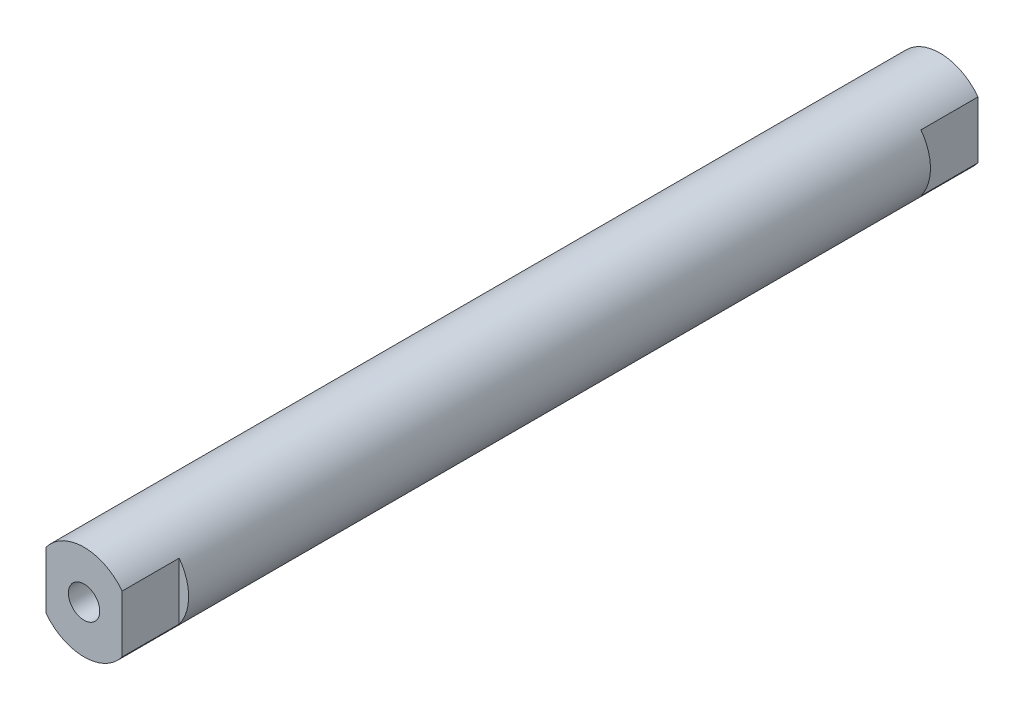
ISO-10303-21;
HEADER;
FILE_DESCRIPTION(('STEP AP214'),'2;1');
FILE_NAME('part.step','',(''),(''),'','','');
FILE_SCHEMA(('AUTOMOTIVE_DESIGN { 1 0 10303 214 1 1 1 1 }'));
ENDSEC;
DATA;
#1=APPLICATION_CONTEXT('core data for automotive mechanical design processes');
#2=APPLICATION_PROTOCOL_DEFINITION('international standard','automotive_design',2000,#1);
#3=PRODUCT_CONTEXT('',#1,'mechanical');
#4=PRODUCT('Part','Part','',(#3));
#5=PRODUCT_RELATED_PRODUCT_CATEGORY('part','',(#4));
#6=PRODUCT_DEFINITION_FORMATION('','',#4);
#7=PRODUCT_DEFINITION_CONTEXT('part definition',#1,'design');
#8=PRODUCT_DEFINITION('design','',#6,#7);
#9=PRODUCT_DEFINITION_SHAPE('','',#8);
#10=(LENGTH_UNIT() NAMED_UNIT(*) SI_UNIT(.MILLI.,.METRE.));
#11=(NAMED_UNIT(*) PLANE_ANGLE_UNIT() SI_UNIT($,.RADIAN.));
#12=(NAMED_UNIT(*) SI_UNIT($,.STERADIAN.) SOLID_ANGLE_UNIT());
#13=UNCERTAINTY_MEASURE_WITH_UNIT(LENGTH_MEASURE(1.E-05),#10,'distance_accuracy_value','');
#14=(GEOMETRIC_REPRESENTATION_CONTEXT(3) GLOBAL_UNCERTAINTY_ASSIGNED_CONTEXT((#13)) GLOBAL_UNIT_ASSIGNED_CONTEXT((#10,
#11,#12)) REPRESENTATION_CONTEXT('',''));
#15=CARTESIAN_POINT('',(0.,0.,0.));
#16=DIRECTION('',(0.,0.,1.));
#17=DIRECTION('',(1.,0.,0.));
#18=AXIS2_PLACEMENT_3D('',#15,#16,#17);
#19=CARTESIAN_POINT('',(0.,0.,45.));
#20=DIRECTION('',(0.,0.,-1.));
#21=DIRECTION('',(-1.,0.,0.));
#22=AXIS2_PLACEMENT_3D('',#19,#20,#21);
#23=CYLINDRICAL_SURFACE('',#22,5.);
#24=CARTESIAN_POINT('',(0.,0.,45.));
#25=DIRECTION('',(0.,0.,1.));
#26=DIRECTION('',(1.,0.,0.));
#27=AXIS2_PLACEMENT_3D('',#24,#25,#26);
#28=CIRCLE('',#27,5.);
#29=CARTESIAN_POINT('',(4.,3.,45.));
#30=VERTEX_POINT('',#29);
#31=CARTESIAN_POINT('',(-4.,3.,45.));
#32=VERTEX_POINT('',#31);
#33=EDGE_CURVE('E44',#30,#32,#28,.T.);
#34=ORIENTED_EDGE('',*,*,#33,.F.);
#35=DIRECTION('',(0.,0.,1.));
#36=VECTOR('',#35,1.);
#37=CARTESIAN_POINT('',(4.,3.,39.));
#38=LINE('',#37,#36);
#39=CARTESIAN_POINT('',(4.,3.,39.));
#40=VERTEX_POINT('',#39);
#41=EDGE_CURVE('E157',#40,#30,#38,.T.);
#42=ORIENTED_EDGE('',*,*,#41,.F.);
#43=CARTESIAN_POINT('',(0.,0.,39.));
#44=DIRECTION('',(0.,0.,1.));
#45=DIRECTION('',(1.,0.,0.));
#46=AXIS2_PLACEMENT_3D('',#43,#44,#45);
#47=CIRCLE('',#46,5.);
#48=CARTESIAN_POINT('',(4.,-3.,39.));
#49=VERTEX_POINT('',#48);
#50=EDGE_CURVE('E152',#49,#40,#47,.T.);
#51=ORIENTED_EDGE('',*,*,#50,.F.);
#52=DIRECTION('',(0.,0.,1.));
#53=VECTOR('',#52,1.);
#54=CARTESIAN_POINT('',(4.,-3.,39.));
#55=LINE('',#54,#53);
#56=CARTESIAN_POINT('',(4.,-3.,45.));
#57=VERTEX_POINT('',#56);
#58=EDGE_CURVE('E159',#49,#57,#55,.T.);
#59=ORIENTED_EDGE('',*,*,#58,.T.);
#60=CARTESIAN_POINT('',(-4.,-3.,45.));
#61=VERTEX_POINT('',#60);
#62=EDGE_CURVE('E11',#61,#57,#28,.T.);
#63=ORIENTED_EDGE('',*,*,#62,.F.);
#64=DIRECTION('',(0.,0.,1.));
#65=VECTOR('',#64,1.);
#66=CARTESIAN_POINT('',(-4.,-3.,39.));
#67=LINE('',#66,#65);
#68=CARTESIAN_POINT('',(-4.,-3.,39.));
#69=VERTEX_POINT('',#68);
#70=EDGE_CURVE('E169',#69,#61,#67,.T.);
#71=ORIENTED_EDGE('',*,*,#70,.F.);
#72=CARTESIAN_POINT('',(0.,0.,39.));
#73=DIRECTION('',(0.,0.,1.));
#74=DIRECTION('',(1.,0.,0.));
#75=AXIS2_PLACEMENT_3D('',#72,#73,#74);
#76=CIRCLE('',#75,5.);
#77=CARTESIAN_POINT('',(-4.,3.,39.));
#78=VERTEX_POINT('',#77);
#79=EDGE_CURVE('E164',#78,#69,#76,.T.);
#80=ORIENTED_EDGE('',*,*,#79,.F.);
#81=DIRECTION('',(0.,0.,1.));
#82=VECTOR('',#81,1.);
#83=CARTESIAN_POINT('',(-4.,3.,39.));
#84=LINE('',#83,#82);
#85=EDGE_CURVE('E172',#78,#32,#84,.T.);
#86=ORIENTED_EDGE('',*,*,#85,.T.);
#87=EDGE_LOOP('',(#34,#42,#51,#59,#63,#71,#80,#86));
#88=FACE_BOUND('',#87,.T.);
#89=DIRECTION('',(0.,0.,-1.));
#90=VECTOR('',#89,1.);
#91=CARTESIAN_POINT('',(4.,-3.,-39.));
#92=LINE('',#91,#90);
#93=CARTESIAN_POINT('',(4.,-3.,-39.));
#94=VERTEX_POINT('',#93);
#95=CARTESIAN_POINT('',(4.,-3.,-45.));
#96=VERTEX_POINT('',#95);
#97=EDGE_CURVE('E51',#94,#96,#92,.T.);
#98=ORIENTED_EDGE('',*,*,#97,.F.);
#99=CARTESIAN_POINT('',(0.,0.,-39.));
#100=DIRECTION('',(0.,0.,1.));
#101=DIRECTION('',(1.,0.,0.));
#102=AXIS2_PLACEMENT_3D('',#99,#100,#101);
#103=CIRCLE('',#102,5.);
#104=CARTESIAN_POINT('',(4.,3.,-39.));
#105=VERTEX_POINT('',#104);
#106=EDGE_CURVE('E120',#94,#105,#103,.T.);
#107=ORIENTED_EDGE('',*,*,#106,.T.);
#108=DIRECTION('',(0.,0.,-1.));
#109=VECTOR('',#108,1.);
#110=CARTESIAN_POINT('',(4.,3.,-39.));
#111=LINE('',#110,#109);
#112=CARTESIAN_POINT('',(4.,3.,-45.));
#113=VERTEX_POINT('',#112);
#114=EDGE_CURVE('E129',#105,#113,#111,.T.);
#115=ORIENTED_EDGE('',*,*,#114,.T.);
#116=CARTESIAN_POINT('',(0.,0.,-45.));
#117=DIRECTION('',(0.,0.,1.));
#118=DIRECTION('',(1.,0.,0.));
#119=AXIS2_PLACEMENT_3D('',#116,#117,#118);
#120=CIRCLE('',#119,5.);
#121=CARTESIAN_POINT('',(-4.,3.,-45.));
#122=VERTEX_POINT('',#121);
#123=EDGE_CURVE('E59',#113,#122,#120,.T.);
#124=ORIENTED_EDGE('',*,*,#123,.T.);
#125=DIRECTION('',(0.,0.,-1.));
#126=VECTOR('',#125,1.);
#127=CARTESIAN_POINT('',(-4.,3.,-39.));
#128=LINE('',#127,#126);
#129=CARTESIAN_POINT('',(-4.,3.,-39.));
#130=VERTEX_POINT('',#129);
#131=EDGE_CURVE('E138',#130,#122,#128,.T.);
#132=ORIENTED_EDGE('',*,*,#131,.F.);
#133=CARTESIAN_POINT('',(0.,0.,-39.));
#134=DIRECTION('',(0.,0.,1.));
#135=DIRECTION('',(1.,0.,0.));
#136=AXIS2_PLACEMENT_3D('',#133,#134,#135);
#137=CIRCLE('',#136,5.);
#138=CARTESIAN_POINT('',(-4.,-3.,-39.));
#139=VERTEX_POINT('',#138);
#140=EDGE_CURVE('E133',#130,#139,#137,.T.);
#141=ORIENTED_EDGE('',*,*,#140,.T.);
#142=DIRECTION('',(0.,0.,-1.));
#143=VECTOR('',#142,1.);
#144=CARTESIAN_POINT('',(-4.,-3.,-39.));
#145=LINE('',#144,#143);
#146=CARTESIAN_POINT('',(-4.,-3.,-45.));
#147=VERTEX_POINT('',#146);
#148=EDGE_CURVE('E141',#139,#147,#145,.T.);
#149=ORIENTED_EDGE('',*,*,#148,.T.);
#150=EDGE_CURVE('E39',#147,#96,#120,.T.);
#151=ORIENTED_EDGE('',*,*,#150,.T.);
#152=EDGE_LOOP('',(#98,#107,#115,#124,#132,#141,#149,#151));
#153=FACE_BOUND('',#152,.T.);
#154=ADVANCED_FACE('F36',(#88,#153),#23,.T.);
#155=CARTESIAN_POINT('',(0.,0.,-45.));
#156=DIRECTION('',(0.,0.,1.));
#157=DIRECTION('',(1.,0.,0.));
#158=AXIS2_PLACEMENT_3D('',#155,#156,#157);
#159=PLANE('',#158);
#160=CARTESIAN_POINT('',(0.,0.,-45.));
#161=DIRECTION('',(0.,0.,-1.));
#162=DIRECTION('',(-1.,0.,0.));
#163=AXIS2_PLACEMENT_3D('',#160,#161,#162);
#164=CIRCLE('',#163,1.65);
#165=CARTESIAN_POINT('',(-1.65,0.,-45.));
#166=VERTEX_POINT('',#165);
#167=EDGE_CURVE('E118',#166,#166,#164,.T.);
#168=ORIENTED_EDGE('',*,*,#167,.F.);
#169=EDGE_LOOP('',(#168));
#170=FACE_BOUND('',#169,.T.);
#171=DIRECTION('',(0.,-1.,0.));
#172=VECTOR('',#171,1.);
#173=CARTESIAN_POINT('',(4.,-3.,-45.));
#174=LINE('',#173,#172);
#175=EDGE_CURVE('E117',#113,#96,#174,.T.);
#176=ORIENTED_EDGE('',*,*,#175,.T.);
#177=ORIENTED_EDGE('',*,*,#150,.F.);
#178=DIRECTION('',(0.,1.,0.));
#179=VECTOR('',#178,1.);
#180=CARTESIAN_POINT('',(-4.,-3.,-45.));
#181=LINE('',#180,#179);
#182=EDGE_CURVE('E131',#147,#122,#181,.T.);
#183=ORIENTED_EDGE('',*,*,#182,.T.);
#184=ORIENTED_EDGE('',*,*,#123,.F.);
#185=EDGE_LOOP('',(#176,#177,#183,#184));
#186=FACE_BOUND('',#185,.T.);
#187=ADVANCED_FACE('F207',(#170,#186),#159,.F.);
#188=CARTESIAN_POINT('',(0.,0.,45.));
#189=DIRECTION('',(0.,0.,1.));
#190=DIRECTION('',(1.,0.,0.));
#191=AXIS2_PLACEMENT_3D('',#188,#189,#190);
#192=PLANE('',#191);
#193=CARTESIAN_POINT('',(0.,0.,45.));
#194=DIRECTION('',(0.,0.,1.));
#195=DIRECTION('',(1.,0.,0.));
#196=AXIS2_PLACEMENT_3D('',#193,#194,#195);
#197=CIRCLE('',#196,1.65);
#198=CARTESIAN_POINT('',(1.65,0.,45.));
#199=VERTEX_POINT('',#198);
#200=EDGE_CURVE('E144',#199,#199,#197,.T.);
#201=ORIENTED_EDGE('',*,*,#200,.F.);
#202=EDGE_LOOP('',(#201));
#203=FACE_BOUND('',#202,.T.);
#204=DIRECTION('',(0.,-1.,0.));
#205=VECTOR('',#204,1.);
#206=CARTESIAN_POINT('',(4.,-3.,45.));
#207=LINE('',#206,#205);
#208=EDGE_CURVE('E151',#30,#57,#207,.T.);
#209=ORIENTED_EDGE('',*,*,#208,.F.);
#210=ORIENTED_EDGE('',*,*,#33,.T.);
#211=DIRECTION('',(0.,1.,0.));
#212=VECTOR('',#211,1.);
#213=CARTESIAN_POINT('',(-4.,-3.,45.));
#214=LINE('',#213,#212);
#215=EDGE_CURVE('E162',#61,#32,#214,.T.);
#216=ORIENTED_EDGE('',*,*,#215,.F.);
#217=ORIENTED_EDGE('',*,*,#62,.T.);
#218=EDGE_LOOP('',(#209,#210,#216,#217));
#219=FACE_BOUND('',#218,.T.);
#220=ADVANCED_FACE('F185',(#203,#219),#192,.T.);
#221=CARTESIAN_POINT('',(-4.,-3.,39.));
#222=DIRECTION('',(1.,0.,0.));
#223=DIRECTION('',(0.,0.,-1.));
#224=AXIS2_PLACEMENT_3D('',#221,#222,#223);
#225=PLANE('',#224);
#226=ORIENTED_EDGE('',*,*,#215,.T.);
#227=ORIENTED_EDGE('',*,*,#85,.F.);
#228=DIRECTION('',(0.,1.,0.));
#229=VECTOR('',#228,1.);
#230=CARTESIAN_POINT('',(-4.,-3.,39.));
#231=LINE('',#230,#229);
#232=EDGE_CURVE('E166',#69,#78,#231,.T.);
#233=ORIENTED_EDGE('',*,*,#232,.F.);
#234=ORIENTED_EDGE('',*,*,#70,.T.);
#235=EDGE_LOOP('',(#226,#227,#233,#234));
#236=FACE_BOUND('',#235,.T.);
#237=ADVANCED_FACE('F179',(#236),#225,.F.);
#238=CARTESIAN_POINT('',(0.,0.,39.));
#239=DIRECTION('',(0.,0.,1.));
#240=DIRECTION('',(1.,0.,0.));
#241=AXIS2_PLACEMENT_3D('',#238,#239,#240);
#242=PLANE('',#241);
#243=ORIENTED_EDGE('',*,*,#79,.T.);
#244=ORIENTED_EDGE('',*,*,#232,.T.);
#245=EDGE_LOOP('',(#243,#244));
#246=FACE_BOUND('',#245,.T.);
#247=ADVANCED_FACE('F204',(#246),#242,.T.);
#248=CARTESIAN_POINT('',(4.,-3.,39.));
#249=DIRECTION('',(-1.,0.,0.));
#250=DIRECTION('',(0.,0.,1.));
#251=AXIS2_PLACEMENT_3D('',#248,#249,#250);
#252=PLANE('',#251);
#253=ORIENTED_EDGE('',*,*,#208,.T.);
#254=ORIENTED_EDGE('',*,*,#58,.F.);
#255=DIRECTION('',(0.,-1.,0.));
#256=VECTOR('',#255,1.);
#257=CARTESIAN_POINT('',(4.,-3.,39.));
#258=LINE('',#257,#256);
#259=EDGE_CURVE('E154',#40,#49,#258,.T.);
#260=ORIENTED_EDGE('',*,*,#259,.F.);
#261=ORIENTED_EDGE('',*,*,#41,.T.);
#262=EDGE_LOOP('',(#253,#254,#260,#261));
#263=FACE_BOUND('',#262,.T.);
#264=ADVANCED_FACE('F191',(#263),#252,.F.);
#265=CARTESIAN_POINT('',(0.,0.,39.));
#266=DIRECTION('',(0.,0.,1.));
#267=DIRECTION('',(1.,0.,0.));
#268=AXIS2_PLACEMENT_3D('',#265,#266,#267);
#269=PLANE('',#268);
#270=ORIENTED_EDGE('',*,*,#50,.T.);
#271=ORIENTED_EDGE('',*,*,#259,.T.);
#272=EDGE_LOOP('',(#270,#271));
#273=FACE_BOUND('',#272,.T.);
#274=ADVANCED_FACE('F193',(#273),#269,.T.);
#275=CARTESIAN_POINT('',(0.,0.,34.9));
#276=DIRECTION('',(0.,0.,1.));
#277=DIRECTION('',(1.,0.,0.));
#278=AXIS2_PLACEMENT_3D('',#275,#276,#277);
#279=CONICAL_SURFACE('',#278,1.65,1.02974425867665);
#280=CARTESIAN_POINT('',(0.,0.,33.9085799786045));
#281=VERTEX_POINT('',#280);
#282=VERTEX_LOOP('',#281);
#283=FACE_BOUND('',#282,.T.);
#284=CARTESIAN_POINT('',(0.,0.,34.9));
#285=DIRECTION('',(0.,0.,1.));
#286=DIRECTION('',(1.,0.,0.));
#287=AXIS2_PLACEMENT_3D('',#284,#285,#286);
#288=CIRCLE('',#287,1.65);
#289=CARTESIAN_POINT('',(1.65,0.,34.9));
#290=VERTEX_POINT('',#289);
#291=EDGE_CURVE('E148',#290,#290,#288,.T.);
#292=ORIENTED_EDGE('',*,*,#291,.T.);
#293=EDGE_LOOP('',(#292));
#294=FACE_BOUND('',#293,.T.);
#295=ADVANCED_FACE('F195',(#283,#294),#279,.F.);
#296=CARTESIAN_POINT('',(0.,0.,45.));
#297=DIRECTION('',(0.,0.,1.));
#298=DIRECTION('',(1.,0.,0.));
#299=AXIS2_PLACEMENT_3D('',#296,#297,#298);
#300=CYLINDRICAL_SURFACE('',#299,1.65);
#301=ORIENTED_EDGE('',*,*,#291,.F.);
#302=EDGE_LOOP('',(#301));
#303=FACE_BOUND('',#302,.T.);
#304=ORIENTED_EDGE('',*,*,#200,.T.);
#305=EDGE_LOOP('',(#304));
#306=FACE_BOUND('',#305,.T.);
#307=ADVANCED_FACE('F201',(#303,#306),#300,.F.);
#308=CARTESIAN_POINT('',(-4.,-3.,-39.));
#309=DIRECTION('',(-1.,0.,0.));
#310=DIRECTION('',(0.,0.,1.));
#311=AXIS2_PLACEMENT_3D('',#308,#309,#310);
#312=PLANE('',#311);
#313=ORIENTED_EDGE('',*,*,#182,.F.);
#314=ORIENTED_EDGE('',*,*,#148,.F.);
#315=DIRECTION('',(0.,1.,0.));
#316=VECTOR('',#315,1.);
#317=CARTESIAN_POINT('',(-4.,-3.,-39.));
#318=LINE('',#317,#316);
#319=EDGE_CURVE('E136',#139,#130,#318,.T.);
#320=ORIENTED_EDGE('',*,*,#319,.T.);
#321=ORIENTED_EDGE('',*,*,#131,.T.);
#322=EDGE_LOOP('',(#313,#314,#320,#321));
#323=FACE_BOUND('',#322,.T.);
#324=ADVANCED_FACE('F244',(#323),#312,.T.);
#325=CARTESIAN_POINT('',(0.,0.,-39.));
#326=DIRECTION('',(0.,0.,-1.));
#327=DIRECTION('',(1.,0.,0.));
#328=AXIS2_PLACEMENT_3D('',#325,#326,#327);
#329=PLANE('',#328);
#330=ORIENTED_EDGE('',*,*,#140,.F.);
#331=ORIENTED_EDGE('',*,*,#319,.F.);
#332=EDGE_LOOP('',(#330,#331));
#333=FACE_BOUND('',#332,.T.);
#334=ADVANCED_FACE('F238',(#333),#329,.T.);
#335=CARTESIAN_POINT('',(4.,-3.,-39.));
#336=DIRECTION('',(1.,0.,0.));
#337=DIRECTION('',(0.,0.,-1.));
#338=AXIS2_PLACEMENT_3D('',#335,#336,#337);
#339=PLANE('',#338);
#340=ORIENTED_EDGE('',*,*,#175,.F.);
#341=ORIENTED_EDGE('',*,*,#114,.F.);
#342=DIRECTION('',(0.,-1.,0.));
#343=VECTOR('',#342,1.);
#344=CARTESIAN_POINT('',(4.,-3.,-39.));
#345=LINE('',#344,#343);
#346=EDGE_CURVE('E127',#105,#94,#345,.T.);
#347=ORIENTED_EDGE('',*,*,#346,.T.);
#348=ORIENTED_EDGE('',*,*,#97,.T.);
#349=EDGE_LOOP('',(#340,#341,#347,#348));
#350=FACE_BOUND('',#349,.T.);
#351=ADVANCED_FACE('F230',(#350),#339,.T.);
#352=CARTESIAN_POINT('',(0.,0.,-39.));
#353=DIRECTION('',(0.,0.,-1.));
#354=DIRECTION('',(1.,0.,0.));
#355=AXIS2_PLACEMENT_3D('',#352,#353,#354);
#356=PLANE('',#355);
#357=ORIENTED_EDGE('',*,*,#106,.F.);
#358=ORIENTED_EDGE('',*,*,#346,.F.);
#359=EDGE_LOOP('',(#357,#358));
#360=FACE_BOUND('',#359,.T.);
#361=ADVANCED_FACE('F111',(#360),#356,.T.);
#362=CARTESIAN_POINT('',(0.,0.,-34.9));
#363=DIRECTION('',(0.,0.,-1.));
#364=DIRECTION('',(-1.,0.,0.));
#365=AXIS2_PLACEMENT_3D('',#362,#363,#364);
#366=CONICAL_SURFACE('',#365,1.65,1.02974425867665);
#367=CARTESIAN_POINT('',(0.,0.,-33.9085799786045));
#368=VERTEX_POINT('',#367);
#369=VERTEX_LOOP('',#368);
#370=FACE_BOUND('',#369,.T.);
#371=CARTESIAN_POINT('',(0.,0.,-34.9));
#372=DIRECTION('',(0.,0.,-1.));
#373=DIRECTION('',(-1.,0.,0.));
#374=AXIS2_PLACEMENT_3D('',#371,#372,#373);
#375=CIRCLE('',#374,1.65);
#376=CARTESIAN_POINT('',(-1.65,0.,-34.9));
#377=VERTEX_POINT('',#376);
#378=EDGE_CURVE('E115',#377,#377,#375,.T.);
#379=ORIENTED_EDGE('',*,*,#378,.T.);
#380=EDGE_LOOP('',(#379));
#381=FACE_BOUND('',#380,.T.);
#382=ADVANCED_FACE('F107',(#370,#381),#366,.F.);
#383=CARTESIAN_POINT('',(0.,0.,-45.));
#384=DIRECTION('',(0.,0.,-1.));
#385=DIRECTION('',(-1.,0.,0.));
#386=AXIS2_PLACEMENT_3D('',#383,#384,#385);
#387=CYLINDRICAL_SURFACE('',#386,1.65);
#388=ORIENTED_EDGE('',*,*,#378,.F.);
#389=EDGE_LOOP('',(#388));
#390=FACE_BOUND('',#389,.T.);
#391=ORIENTED_EDGE('',*,*,#167,.T.);
#392=EDGE_LOOP('',(#391));
#393=FACE_BOUND('',#392,.T.);
#394=ADVANCED_FACE('F110',(#390,#393),#387,.F.);
#395=CLOSED_SHELL('',(#154,#187,#220,#237,#247,#264,#274,#295,#307,#324,#334,#351,#361,#382,#394));
#396=MANIFOLD_SOLID_BREP('B2',#395);
#397=ADVANCED_BREP_SHAPE_REPRESENTATION('',(#18,#396),#14);
#398=SHAPE_DEFINITION_REPRESENTATION(#9,#397);
ENDSEC;
END-ISO-10303-21;
